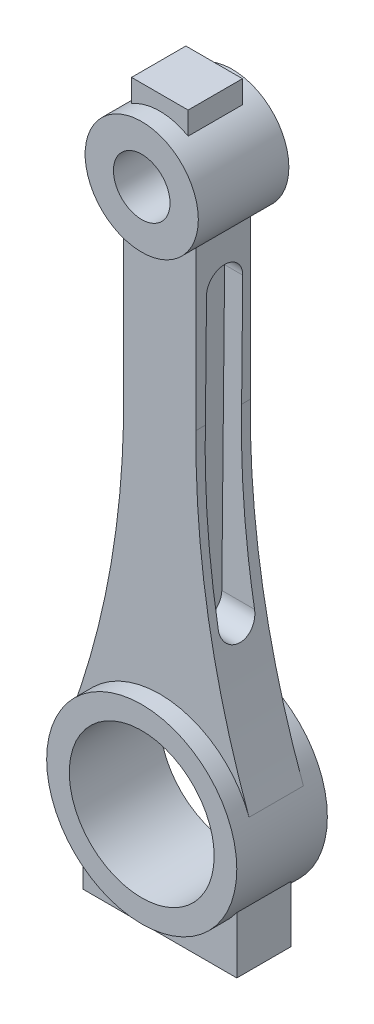
ISO-10303-21;
HEADER;
FILE_DESCRIPTION(('STEP AP214'),'2;1');
FILE_NAME('part.step','',(''),(''),'','','');
FILE_SCHEMA(('AUTOMOTIVE_DESIGN { 1 0 10303 214 1 1 1 1 }'));
ENDSEC;
DATA;
#1=APPLICATION_CONTEXT('core data for automotive mechanical design processes');
#2=APPLICATION_PROTOCOL_DEFINITION('international standard','automotive_design',2000,#1);
#3=PRODUCT_CONTEXT('',#1,'mechanical');
#4=PRODUCT('Part','Part','',(#3));
#5=PRODUCT_RELATED_PRODUCT_CATEGORY('part','',(#4));
#6=PRODUCT_DEFINITION_FORMATION('','',#4);
#7=PRODUCT_DEFINITION_CONTEXT('part definition',#1,'design');
#8=PRODUCT_DEFINITION('design','',#6,#7);
#9=PRODUCT_DEFINITION_SHAPE('','',#8);
#10=(LENGTH_UNIT() NAMED_UNIT(*) SI_UNIT(.MILLI.,.METRE.));
#11=(NAMED_UNIT(*) PLANE_ANGLE_UNIT() SI_UNIT($,.RADIAN.));
#12=(NAMED_UNIT(*) SI_UNIT($,.STERADIAN.) SOLID_ANGLE_UNIT());
#13=UNCERTAINTY_MEASURE_WITH_UNIT(LENGTH_MEASURE(1.E-05),#10,'distance_accuracy_value','');
#14=(GEOMETRIC_REPRESENTATION_CONTEXT(3) GLOBAL_UNCERTAINTY_ASSIGNED_CONTEXT((#13)) GLOBAL_UNIT_ASSIGNED_CONTEXT((#10,
#11,#12)) REPRESENTATION_CONTEXT('',''));
#15=CARTESIAN_POINT('',(0.,0.,0.));
#16=DIRECTION('',(0.,0.,1.));
#17=DIRECTION('',(1.,0.,0.));
#18=AXIS2_PLACEMENT_3D('',#15,#16,#17);
#19=CARTESIAN_POINT('',(197.984393718025,72.9601250280331,6.));
#20=DIRECTION('',(0.,0.,-1.));
#21=DIRECTION('',(-1.,0.,0.));
#22=AXIS2_PLACEMENT_3D('',#19,#20,#21);
#23=CYLINDRICAL_SURFACE('',#22,190.);
#24=CARTESIAN_POINT('',(11.2359380374151,37.9599207299516,-3.68916926509044));
#25=CARTESIAN_POINT('',(11.2573392899035,37.8457258024845,-3.68803464444008));
#26=CARTESIAN_POINT('',(11.2788373766301,37.731603732862,-3.68199054216258));
#27=CARTESIAN_POINT('',(11.3218694534566,37.5043030453218,-3.66017608058678));
#28=CARTESIAN_POINT('',(11.3434034424995,37.3911244001991,-3.64440600274162));
#29=CARTESIAN_POINT('',(11.3863453669897,37.1665300941619,-3.6032374435139));
#30=CARTESIAN_POINT('',(11.4077533330348,37.0551139932032,-3.57784140621044));
#31=CARTESIAN_POINT('',(11.450277832694,36.8348399688653,-3.51761471406636));
#32=CARTESIAN_POINT('',(11.4713943703932,36.7259820096127,-3.48278419161355));
#33=CARTESIAN_POINT('',(11.5340849236126,36.4042790668273,-3.364392398952));
#34=CARTESIAN_POINT('',(11.5750139767093,36.1962313899327,-3.26691735932956));
#35=CARTESIAN_POINT('',(11.6536808263568,35.7995751844103,-3.03760322738277));
#36=CARTESIAN_POINT('',(11.6914195686109,35.6109608914949,-2.90577436619742));
#37=CARTESIAN_POINT('',(11.7621789532305,35.2597453331294,-2.61221230413649));
#38=CARTESIAN_POINT('',(11.7952291859196,35.0969800694814,-2.45068292519178));
#39=CARTESIAN_POINT('',(11.8556681092971,34.8009793008838,-2.1015569995153));
#40=CARTESIAN_POINT('',(11.8830564389087,34.6677456792172,-1.91395879157032));
#41=CARTESIAN_POINT('',(11.9306424010361,34.4372061955792,-1.52166792073354));
#42=CARTESIAN_POINT('',(11.9509617849072,34.3392908176257,-1.31734833457949));
#43=CARTESIAN_POINT('',(11.9842669986154,34.1792070849224,-0.894610169687628));
#44=CARTESIAN_POINT('',(11.9972541680644,34.1170322002674,-0.676194174525959));
#45=CARTESIAN_POINT('',(12.0151816646436,34.0312916741689,-0.23590832566454));
#46=CARTESIAN_POINT('',(12.0202699533025,34.007016054454,-0.0141825700637141));
#47=CARTESIAN_POINT('',(12.0226582837732,33.9956155881816,0.430261163530409));
#48=CARTESIAN_POINT('',(12.0199587031381,34.0084889406554,0.652979092900833));
#49=CARTESIAN_POINT('',(12.0069443635972,34.0706752265108,1.09094000003295));
#50=CARTESIAN_POINT('',(11.9966995967896,34.119653242678,1.30623276574449));
#51=CARTESIAN_POINT('',(11.9690867282807,34.2521141428991,1.72543520117346));
#52=CARTESIAN_POINT('',(11.9517185363491,34.3355974640224,1.92934472666529));
#53=CARTESIAN_POINT('',(11.9104122047552,34.5350838516441,2.32135267206067));
#54=CARTESIAN_POINT('',(11.8864364029693,34.6512734213227,2.50935212635597));
#55=CARTESIAN_POINT('',(11.8328575586188,34.9124798052443,2.86319467439356));
#56=CARTESIAN_POINT('',(11.8032543529373,35.0574974551093,3.02903712565121));
#57=CARTESIAN_POINT('',(11.7389199818753,35.3748869564478,3.33693080705317));
#58=CARTESIAN_POINT('',(11.7041099193395,35.5476834273039,3.4785276771088));
#59=CARTESIAN_POINT('',(11.6309262369291,35.9139377996248,3.73083648432788));
#60=CARTESIAN_POINT('',(11.5925511218324,36.1074043755099,3.84153538388699));
#61=CARTESIAN_POINT('',(11.5126998641564,36.5135741817407,4.03108537928807));
#62=CARTESIAN_POINT('',(11.4711772530887,36.7265832767776,4.10925990249678));
#63=CARTESIAN_POINT('',(11.3870486928273,37.1623617440236,4.2284400309754));
#64=CARTESIAN_POINT('',(11.3444443948312,37.38511657585,4.26949915366615));
#65=CARTESIAN_POINT('',(11.2884030309025,37.681059797501,4.29854682025038));
#66=CARTESIAN_POINT('',(11.27485640803,37.7528239617369,4.30363529006597));
#67=CARTESIAN_POINT('',(11.2478376464841,37.8964125953903,4.30993120036429));
#68=CARTESIAN_POINT('',(11.2343654214005,37.9682367659793,4.31114508186216));
#69=CARTESIAN_POINT('',(11.2209326121106,38.0400792700484,4.31042913785765));
#70=B_SPLINE_CURVE_WITH_KNOTS('',3,(#24,#25,#26,#27,#28,#29,#30,#31,#32,#33,#34,#35,#36,#37,#38,
#39,#40,#41,#42,#43,#44,#45,#46,#47,#48,#49,#50,#51,#52,#53,#54,#55,#56,#57,#58,#59,#60,#61,#62,
#63,#64,#65,#66,#67,#68,#69),.UNSPECIFIED.,.F.,.F.,(4,2,2,2,2,2,2,2,2,2,2,2,2,2,2,2,2,2,2,2,2,2,
4),(0.,0.348452687276947,0.696895291400956,1.04524948341088,1.39359878745351,2.09007173351595,
2.78633749493858,3.47799226371899,4.16969112782026,4.84880634594527,5.52779744802792,
6.1939093019402,6.85998886353357,7.51996621906253,8.17995193460444,8.8437801486304,
9.50762760744787,10.1828051382855,10.8582671355624,11.5471515126776,12.235040982105,
12.4545941587138,12.6737821652143),.UNSPECIFIED.);
#71=CARTESIAN_POINT('',(11.2359380374151,37.9599207299516,-3.68916926509044));
#72=VERTEX_POINT('',#71);
#73=CARTESIAN_POINT('',(11.2209326121106,38.0400792700484,4.31042913785765));
#74=VERTEX_POINT('',#73);
#75=EDGE_CURVE('E482',#72,#74,#70,.T.);
#76=ORIENTED_EDGE('',*,*,#75,.T.);
#77=CARTESIAN_POINT('',(197.984393718025,72.9601250280331,3.96051908649262));
#78=DIRECTION('',(0.,-0.010019817512106,-0.99994980036851));
#79=DIRECTION('',(0.,0.999949800368511,-0.010019817512106));
#80=AXIS2_PLACEMENT_3D('',#77,#78,#79);
#81=ELLIPSE('',#80,190.009538408808,190.);
#82=CARTESIAN_POINT('',(8.00000000000001,75.3953136438507,3.93611771601476));
#83=VERTEX_POINT('',#82);
#84=EDGE_CURVE('E280',#74,#83,#81,.T.);
#85=ORIENTED_EDGE('',*,*,#84,.T.);
#86=DIRECTION('',(0.,0.,-1.));
#87=VECTOR('',#86,1.);
#88=CARTESIAN_POINT('',(8.00000000000001,75.3953136438507,6.));
#89=LINE('',#88,#87);
#90=CARTESIAN_POINT('',(8.00000000000001,75.3953136438507,6.));
#91=VERTEX_POINT('',#90);
#92=EDGE_CURVE('E437',#91,#83,#89,.T.);
#93=ORIENTED_EDGE('',*,*,#92,.F.);
#94=CARTESIAN_POINT('',(197.984393718025,72.9601250280331,6.));
#95=DIRECTION('',(0.,0.,1.));
#96=DIRECTION('',(1.,0.,0.));
#97=AXIS2_PLACEMENT_3D('',#94,#95,#96);
#98=CIRCLE('',#97,190.);
#99=CARTESIAN_POINT('',(19.7046079055854,7.26143424449618,6.));
#100=VERTEX_POINT('',#99);
#101=EDGE_CURVE('E403',#91,#100,#98,.T.);
#102=ORIENTED_EDGE('',*,*,#101,.T.);
#103=DIRECTION('',(0.,0.,-1.));
#104=VECTOR('',#103,1.);
#105=CARTESIAN_POINT('',(19.7046079055854,7.26143424449618,6.));
#106=LINE('',#105,#104);
#107=CARTESIAN_POINT('',(19.7046079055854,7.26143424449618,-6.));
#108=VERTEX_POINT('',#107);
#109=EDGE_CURVE('E441',#100,#108,#106,.T.);
#110=ORIENTED_EDGE('',*,*,#109,.T.);
#111=CARTESIAN_POINT('',(197.984393718025,72.9601250280331,-6.));
#112=DIRECTION('',(0.,0.,1.));
#113=DIRECTION('',(1.,0.,0.));
#114=AXIS2_PLACEMENT_3D('',#111,#112,#113);
#115=CIRCLE('',#114,190.);
#116=CARTESIAN_POINT('',(8.00000000000001,75.3953136438507,-6.));
#117=VERTEX_POINT('',#116);
#118=EDGE_CURVE('E427',#117,#108,#115,.T.);
#119=ORIENTED_EDGE('',*,*,#118,.F.);
#120=CARTESIAN_POINT('',(8.00000000000001,75.3953136438507,-4.06428390119819));
#121=VERTEX_POINT('',#120);
#122=EDGE_CURVE('E436',#121,#117,#89,.T.);
#123=ORIENTED_EDGE('',*,*,#122,.F.);
#124=CARTESIAN_POINT('',(197.984393718025,72.9601250280331,-4.03988253072034));
#125=DIRECTION('',(0.,0.010019817512106,0.999949800368511));
#126=DIRECTION('',(0.,0.999949800368511,-0.010019817512106));
#127=AXIS2_PLACEMENT_3D('',#124,#125,#126);
#128=ELLIPSE('',#127,190.009538408808,190.);
#129=EDGE_CURVE('E67',#121,#72,#128,.T.);
#130=ORIENTED_EDGE('',*,*,#129,.T.);
#131=EDGE_LOOP('',(#76,#85,#93,#102,#110,#119,#123,#130));
#132=FACE_BOUND('',#131,.T.);
#133=ADVANCED_FACE('F43',(#132),#23,.F.);
#134=CARTESIAN_POINT('',(8.00000000000002,0.,6.));
#135=DIRECTION('',(-1.,0.,0.));
#136=DIRECTION('',(0.,-1.,0.));
#137=AXIS2_PLACEMENT_3D('',#134,#135,#136);
#138=PLANE('',#137);
#139=DIRECTION('',(0.,-0.999949800368511,0.010019817512106));
#140=VECTOR('',#139,1.);
#141=CARTESIAN_POINT('',(8.00000000000002,-0.0131092418119929,4.69173428387807));
#142=LINE('',#141,#140);
#143=CARTESIAN_POINT('',(8.00000000000001,100.040079270048,3.6891692650904));
#144=VERTEX_POINT('',#143);
#145=EDGE_CURVE('E479',#144,#83,#142,.T.);
#146=ORIENTED_EDGE('',*,*,#145,.F.);
#147=CARTESIAN_POINT('',(8.,100.,-0.310629936383641));
#148=DIRECTION('',(-1.,0.,0.));
#149=DIRECTION('',(0.,-1.,0.));
#150=AXIS2_PLACEMENT_3D('',#147,#148,#149);
#151=CIRCLE('',#150,4.);
#152=CARTESIAN_POINT('',(8.00000000000001,99.9599207299516,-4.31042913785768));
#153=VERTEX_POINT('',#152);
#154=EDGE_CURVE('E476',#153,#144,#151,.F.);
#155=ORIENTED_EDGE('',*,*,#154,.F.);
#156=DIRECTION('',(0.,0.999949800368511,-0.010019817512106));
#157=VECTOR('',#156,1.);
#158=CARTESIAN_POINT('',(8.00000000000002,-0.0932677819088409,-3.30786411907001));
#159=LINE('',#158,#157);
#160=EDGE_CURVE('E467',#121,#153,#159,.T.);
#161=ORIENTED_EDGE('',*,*,#160,.F.);
#162=ORIENTED_EDGE('',*,*,#122,.T.);
#163=DIRECTION('',(0.,1.,0.));
#164=VECTOR('',#163,1.);
#165=CARTESIAN_POINT('',(8.00000000000002,0.,-6.));
#166=LINE('',#165,#164);
#167=CARTESIAN_POINT('',(8.,110.395313643851,-6.));
#168=VERTEX_POINT('',#167);
#169=EDGE_CURVE('E392',#117,#168,#166,.T.);
#170=ORIENTED_EDGE('',*,*,#169,.T.);
#171=DIRECTION('',(0.,0.,-1.));
#172=VECTOR('',#171,1.);
#173=CARTESIAN_POINT('',(8.,110.395313643851,6.));
#174=LINE('',#173,#172);
#175=CARTESIAN_POINT('',(8.,110.395313643851,6.));
#176=VERTEX_POINT('',#175);
#177=EDGE_CURVE('E411',#176,#168,#174,.T.);
#178=ORIENTED_EDGE('',*,*,#177,.F.);
#179=DIRECTION('',(0.,1.,0.));
#180=VECTOR('',#179,1.);
#181=CARTESIAN_POINT('',(8.00000000000002,0.,6.));
#182=LINE('',#181,#180);
#183=EDGE_CURVE('E407',#91,#176,#182,.T.);
#184=ORIENTED_EDGE('',*,*,#183,.F.);
#185=ORIENTED_EDGE('',*,*,#92,.T.);
#186=EDGE_LOOP('',(#146,#155,#161,#162,#170,#178,#184,#185));
#187=FACE_BOUND('',#186,.T.);
#188=ADVANCED_FACE('F577',(#187),#138,.F.);
#189=CARTESIAN_POINT('',(0.,120.,10.));
#190=DIRECTION('',(0.,0.,-1.));
#191=DIRECTION('',(-1.,0.,0.));
#192=AXIS2_PLACEMENT_3D('',#189,#190,#191);
#193=CYLINDRICAL_SURFACE('',#192,6.25);
#194=CARTESIAN_POINT('',(0.,120.,10.));
#195=DIRECTION('',(0.,0.,1.));
#196=DIRECTION('',(1.,0.,0.));
#197=AXIS2_PLACEMENT_3D('',#194,#195,#196);
#198=CIRCLE('',#197,6.25);
#199=CARTESIAN_POINT('',(6.25,120.,10.));
#200=VERTEX_POINT('',#199);
#201=EDGE_CURVE('E458',#200,#200,#198,.T.);
#202=ORIENTED_EDGE('',*,*,#201,.T.);
#203=EDGE_LOOP('',(#202));
#204=FACE_BOUND('',#203,.T.);
#205=CARTESIAN_POINT('',(0.,120.,-10.));
#206=DIRECTION('',(0.,0.,1.));
#207=DIRECTION('',(1.,0.,0.));
#208=AXIS2_PLACEMENT_3D('',#205,#206,#207);
#209=CIRCLE('',#208,6.25);
#210=CARTESIAN_POINT('',(6.25,120.,-10.));
#211=VERTEX_POINT('',#210);
#212=EDGE_CURVE('E457',#211,#211,#209,.T.);
#213=ORIENTED_EDGE('',*,*,#212,.F.);
#214=EDGE_LOOP('',(#213));
#215=FACE_BOUND('',#214,.T.);
#216=ADVANCED_FACE('F45',(#204,#215),#193,.F.);
#217=CARTESIAN_POINT('',(0.,120.,10.));
#218=DIRECTION('',(0.,0.,-1.));
#219=DIRECTION('',(-1.,0.,0.));
#220=AXIS2_PLACEMENT_3D('',#217,#218,#219);
#221=CYLINDRICAL_SURFACE('',#220,12.5);
#222=DIRECTION('',(0.,0.,-1.));
#223=VECTOR('',#222,1.);
#224=CARTESIAN_POINT('',(6.25,130.825317547305,6.));
#225=LINE('',#224,#223);
#226=CARTESIAN_POINT('',(6.25,130.825317547305,6.));
#227=VERTEX_POINT('',#226);
#228=CARTESIAN_POINT('',(6.25,130.825317547305,-6.));
#229=VERTEX_POINT('',#228);
#230=EDGE_CURVE('E318',#227,#229,#225,.T.);
#231=ORIENTED_EDGE('',*,*,#230,.F.);
#232=CARTESIAN_POINT('',(0.,120.,6.));
#233=DIRECTION('',(0.,0.,1.));
#234=DIRECTION('',(1.,0.,0.));
#235=AXIS2_PLACEMENT_3D('',#232,#233,#234);
#236=CIRCLE('',#235,12.5);
#237=CARTESIAN_POINT('',(-6.25,130.825317547305,6.));
#238=VERTEX_POINT('',#237);
#239=EDGE_CURVE('E294',#227,#238,#236,.T.);
#240=ORIENTED_EDGE('',*,*,#239,.T.);
#241=DIRECTION('',(0.,0.,-1.));
#242=VECTOR('',#241,1.);
#243=CARTESIAN_POINT('',(-6.25,130.825317547305,6.));
#244=LINE('',#243,#242);
#245=CARTESIAN_POINT('',(-6.25,130.825317547305,-6.));
#246=VERTEX_POINT('',#245);
#247=EDGE_CURVE('E322',#238,#246,#244,.T.);
#248=ORIENTED_EDGE('',*,*,#247,.T.);
#249=CARTESIAN_POINT('',(0.,120.,-6.));
#250=DIRECTION('',(0.,0.,1.));
#251=DIRECTION('',(1.,0.,0.));
#252=AXIS2_PLACEMENT_3D('',#249,#250,#251);
#253=CIRCLE('',#252,12.5);
#254=EDGE_CURVE('E309',#229,#246,#253,.T.);
#255=ORIENTED_EDGE('',*,*,#254,.F.);
#256=EDGE_LOOP('',(#231,#240,#248,#255));
#257=FACE_BOUND('',#256,.T.);
#258=DIRECTION('',(0.,0.,-1.));
#259=VECTOR('',#258,1.);
#260=CARTESIAN_POINT('',(-7.99999999999999,110.395313643851,6.));
#261=LINE('',#260,#259);
#262=CARTESIAN_POINT('',(-7.99999999999999,110.395313643851,6.));
#263=VERTEX_POINT('',#262);
#264=CARTESIAN_POINT('',(-7.99999999999999,110.395313643851,-6.));
#265=VERTEX_POINT('',#264);
#266=EDGE_CURVE('E453',#263,#265,#261,.T.);
#267=ORIENTED_EDGE('',*,*,#266,.F.);
#268=CARTESIAN_POINT('',(0.,120.,6.));
#269=DIRECTION('',(0.,0.,1.));
#270=DIRECTION('',(1.,0.,0.));
#271=AXIS2_PLACEMENT_3D('',#268,#269,#270);
#272=CIRCLE('',#271,12.5);
#273=EDGE_CURVE('E388',#263,#176,#272,.T.);
#274=ORIENTED_EDGE('',*,*,#273,.T.);
#275=ORIENTED_EDGE('',*,*,#177,.T.);
#276=CARTESIAN_POINT('',(0.,120.,-6.));
#277=DIRECTION('',(0.,0.,1.));
#278=DIRECTION('',(1.,0.,0.));
#279=AXIS2_PLACEMENT_3D('',#276,#277,#278);
#280=CIRCLE('',#279,12.5);
#281=EDGE_CURVE('E381',#265,#168,#280,.T.);
#282=ORIENTED_EDGE('',*,*,#281,.F.);
#283=EDGE_LOOP('',(#267,#274,#275,#282));
#284=FACE_BOUND('',#283,.T.);
#285=CARTESIAN_POINT('',(0.,120.,10.));
#286=DIRECTION('',(0.,0.,1.));
#287=DIRECTION('',(1.,0.,0.));
#288=AXIS2_PLACEMENT_3D('',#285,#286,#287);
#289=CIRCLE('',#288,12.5);
#290=CARTESIAN_POINT('',(12.5,120.,10.));
#291=VERTEX_POINT('',#290);
#292=EDGE_CURVE('E462',#291,#291,#289,.T.);
#293=ORIENTED_EDGE('',*,*,#292,.F.);
#294=EDGE_LOOP('',(#293));
#295=FACE_BOUND('',#294,.T.);
#296=CARTESIAN_POINT('',(0.,120.,-10.));
#297=DIRECTION('',(0.,0.,1.));
#298=DIRECTION('',(1.,0.,0.));
#299=AXIS2_PLACEMENT_3D('',#296,#297,#298);
#300=CIRCLE('',#299,12.5);
#301=CARTESIAN_POINT('',(12.5,120.,-10.));
#302=VERTEX_POINT('',#301);
#303=EDGE_CURVE('E463',#302,#302,#300,.T.);
#304=ORIENTED_EDGE('',*,*,#303,.T.);
#305=EDGE_LOOP('',(#304));
#306=FACE_BOUND('',#305,.T.);
#307=ADVANCED_FACE('F584',(#257,#284,#295,#306),#221,.T.);
#308=CARTESIAN_POINT('',(0.,0.,10.));
#309=DIRECTION('',(0.,0.,1.));
#310=DIRECTION('',(1.,0.,0.));
#311=AXIS2_PLACEMENT_3D('',#308,#309,#310);
#312=PLANE('',#311);
#313=ORIENTED_EDGE('',*,*,#201,.F.);
#314=EDGE_LOOP('',(#313));
#315=FACE_BOUND('',#314,.T.);
#316=ORIENTED_EDGE('',*,*,#292,.T.);
#317=EDGE_LOOP('',(#316));
#318=FACE_BOUND('',#317,.T.);
#319=ADVANCED_FACE('F632',(#315,#318),#312,.T.);
#320=CARTESIAN_POINT('',(0.,0.,-10.));
#321=DIRECTION('',(0.,0.,1.));
#322=DIRECTION('',(1.,0.,0.));
#323=AXIS2_PLACEMENT_3D('',#320,#321,#322);
#324=PLANE('',#323);
#325=ORIENTED_EDGE('',*,*,#212,.T.);
#326=EDGE_LOOP('',(#325));
#327=FACE_BOUND('',#326,.T.);
#328=ORIENTED_EDGE('',*,*,#303,.F.);
#329=EDGE_LOOP('',(#328));
#330=FACE_BOUND('',#329,.T.);
#331=ADVANCED_FACE('F630',(#327,#330),#324,.F.);
#332=CARTESIAN_POINT('',(-7.99999999999999,0.,6.));
#333=DIRECTION('',(-1.,0.,0.));
#334=DIRECTION('',(0.,0.,1.));
#335=AXIS2_PLACEMENT_3D('',#332,#333,#334);
#336=PLANE('',#335);
#337=DIRECTION('',(0.,-0.999949800368511,0.010019817512106));
#338=VECTOR('',#337,1.);
#339=CARTESIAN_POINT('',(-7.99999999999999,-0.0932677819088425,-3.30786411907001));
#340=LINE('',#339,#338);
#341=CARTESIAN_POINT('',(-8.,99.9599207299516,-4.31042913785768));
#342=VERTEX_POINT('',#341);
#343=CARTESIAN_POINT('',(-8.00000000000001,75.3953136438507,-4.06428390119819));
#344=VERTEX_POINT('',#343);
#345=EDGE_CURVE('E247',#342,#344,#340,.T.);
#346=ORIENTED_EDGE('',*,*,#345,.F.);
#347=CARTESIAN_POINT('',(-7.99999999999999,100.,-0.310629936383641));
#348=DIRECTION('',(-1.,0.,0.));
#349=DIRECTION('',(0.,0.,1.));
#350=AXIS2_PLACEMENT_3D('',#347,#348,#349);
#351=CIRCLE('',#350,4.);
#352=CARTESIAN_POINT('',(-8.,100.040079270048,3.6891692650904));
#353=VERTEX_POINT('',#352);
#354=EDGE_CURVE('E11',#353,#342,#351,.T.);
#355=ORIENTED_EDGE('',*,*,#354,.F.);
#356=DIRECTION('',(0.,0.999949800368511,-0.010019817512106));
#357=VECTOR('',#356,1.);
#358=CARTESIAN_POINT('',(-7.99999999999999,-0.0131092418119945,4.69173428387807));
#359=LINE('',#358,#357);
#360=CARTESIAN_POINT('',(-8.00000000000001,75.3953136438507,3.93611771601476));
#361=VERTEX_POINT('',#360);
#362=EDGE_CURVE('E215',#361,#353,#359,.T.);
#363=ORIENTED_EDGE('',*,*,#362,.F.);
#364=DIRECTION('',(0.,0.,-1.));
#365=VECTOR('',#364,1.);
#366=CARTESIAN_POINT('',(-7.99999999999999,75.3953136438507,6.));
#367=LINE('',#366,#365);
#368=CARTESIAN_POINT('',(-7.99999999999999,75.3953136438507,6.));
#369=VERTEX_POINT('',#368);
#370=EDGE_CURVE('E449',#369,#361,#367,.T.);
#371=ORIENTED_EDGE('',*,*,#370,.F.);
#372=DIRECTION('',(0.,1.,0.));
#373=VECTOR('',#372,1.);
#374=CARTESIAN_POINT('',(-7.99999999999999,0.,6.));
#375=LINE('',#374,#373);
#376=EDGE_CURVE('E391',#369,#263,#375,.T.);
#377=ORIENTED_EDGE('',*,*,#376,.T.);
#378=ORIENTED_EDGE('',*,*,#266,.T.);
#379=DIRECTION('',(0.,1.,0.));
#380=VECTOR('',#379,1.);
#381=CARTESIAN_POINT('',(-7.99999999999999,0.,-6.));
#382=LINE('',#381,#380);
#383=CARTESIAN_POINT('',(-7.99999999999999,75.3953136438507,-6.));
#384=VERTEX_POINT('',#383);
#385=EDGE_CURVE('E415',#384,#265,#382,.T.);
#386=ORIENTED_EDGE('',*,*,#385,.F.);
#387=EDGE_CURVE('E448',#344,#384,#367,.T.);
#388=ORIENTED_EDGE('',*,*,#387,.F.);
#389=EDGE_LOOP('',(#346,#355,#363,#371,#377,#378,#386,#388));
#390=FACE_BOUND('',#389,.T.);
#391=ADVANCED_FACE('F626',(#390),#336,.T.);
#392=CARTESIAN_POINT('',(-197.984393718025,72.960125028033,6.));
#393=DIRECTION('',(0.,0.,-1.));
#394=DIRECTION('',(-1.,0.,0.));
#395=AXIS2_PLACEMENT_3D('',#392,#393,#394);
#396=CYLINDRICAL_SURFACE('',#395,190.);
#397=CARTESIAN_POINT('',(-11.2209326121106,38.0400792700484,4.31042913785765));
#398=CARTESIAN_POINT('',(-11.2422918197905,37.9258378445489,4.31158354900229));
#399=CARTESIAN_POINT('',(-11.2637657264759,37.8115743068779,4.30782392249587));
#400=CARTESIAN_POINT('',(-11.3067860096547,37.5838037096387,4.29055524600473));
#401=CARTESIAN_POINT('',(-11.3283323837532,37.4702966254336,4.27704651512004));
#402=CARTESIAN_POINT('',(-11.3713360230604,37.2448638704104,4.24036352406868));
#403=CARTESIAN_POINT('',(-11.3927933117012,37.1329377623256,4.21719199278791));
#404=CARTESIAN_POINT('',(-11.4354546292819,36.9114624877695,4.16136313139912));
#405=CARTESIAN_POINT('',(-11.456658661519,36.8019132903368,4.12870592493038));
#406=CARTESIAN_POINT('',(-11.5196690865464,36.4778735422106,4.0167407927167));
#407=CARTESIAN_POINT('',(-11.5608887463665,36.2679126279731,3.92342657480642));
#408=CARTESIAN_POINT('',(-11.6402923007287,35.8667587072866,3.70206303987675));
#409=CARTESIAN_POINT('',(-11.6784770610995,35.6755603443758,3.57402367594822));
#410=CARTESIAN_POINT('',(-11.7502934240686,35.3184875444892,3.2874642234685));
#411=CARTESIAN_POINT('',(-11.7839513578261,35.1524658712039,3.12913465727676));
#412=CARTESIAN_POINT('',(-11.8457335178769,34.8494550108252,2.78580511654033));
#413=CARTESIAN_POINT('',(-11.8738573860849,34.7124677023755,2.60080341749879));
#414=CARTESIAN_POINT('',(-11.9230138009257,34.4740560120361,2.21289698958114));
#415=CARTESIAN_POINT('',(-11.9441637715485,34.3720414627228,2.01036998990736));
#416=CARTESIAN_POINT('',(-11.9791948759147,34.2035325153383,1.59047009674739));
#417=CARTESIAN_POINT('',(-11.993077340224,34.1370316152324,1.3730999290554));
#418=CARTESIAN_POINT('',(-12.0128034187397,34.0426495179178,0.934170478014535));
#419=CARTESIAN_POINT('',(-12.0187964952649,34.0140502127713,0.712772148133114));
#420=CARTESIAN_POINT('',(-12.0229877426866,33.9940423054742,0.268230415957506));
#421=CARTESIAN_POINT('',(-12.0211863264954,34.0026317332551,0.0450871067284754));
#422=CARTESIAN_POINT('',(-12.0099210964895,34.0564457972838,-0.394267901498412));
#423=CARTESIAN_POINT('',(-12.0005337073741,34.1013050365447,-0.610526480051656));
#424=CARTESIAN_POINT('',(-11.9745716439461,34.2257720652061,-1.03233692067507));
#425=CARTESIAN_POINT('',(-11.9579969122864,34.3053801318643,-1.23788869730198));
#426=CARTESIAN_POINT('',(-11.9182072247445,34.4973657269376,-1.63363456728297));
#427=CARTESIAN_POINT('',(-11.8949596525242,34.6099042708896,-1.82374719158603));
#428=CARTESIAN_POINT('',(-11.8427327351194,34.8642086745661,-2.18238941226392));
#429=CARTESIAN_POINT('',(-11.8137532402174,35.0059752977303,-2.35091844468726));
#430=CARTESIAN_POINT('',(-11.7505689303897,35.3172228621859,-2.66465893362602));
#431=CARTESIAN_POINT('',(-11.7162852279883,35.4871255124034,-2.80943597784595));
#432=CARTESIAN_POINT('',(-11.644022023652,35.8481361437127,-3.06855150499719));
#433=CARTESIAN_POINT('',(-11.6060409711496,36.0392530262272,-3.18287714169617));
#434=CARTESIAN_POINT('',(-11.5268393179619,36.4413186665105,-3.38012671679121));
#435=CARTESIAN_POINT('',(-11.485569057416,36.6525880495257,-3.46237560754309));
#436=CARTESIAN_POINT('',(-11.4017989792526,37.0855693552885,-3.58996005288053));
#437=CARTESIAN_POINT('',(-11.3593010170352,37.3072658087564,-3.63534857198765));
#438=CARTESIAN_POINT('',(-11.3033281867263,37.6021683049548,-3.67018738013791));
#439=CARTESIAN_POINT('',(-11.28980773696,37.6736276547905,-3.67668008588045));
#440=CARTESIAN_POINT('',(-11.2628268326493,37.8166800576629,-3.68580689576495));
#441=CARTESIAN_POINT('',(-11.2493663157002,37.8882726901241,-3.68844740501623));
#442=CARTESIAN_POINT('',(-11.2359380374151,37.9599207299516,-3.68916926509044));
#443=B_SPLINE_CURVE_WITH_KNOTS('',3,(#397,#398,#399,#400,#401,#402,#403,#404,#405,#406,#407,
#408,#409,#410,#411,#412,#413,#414,#415,#416,#417,#418,#419,#420,#421,#422,#423,#424,#425,#426,
#427,#428,#429,#430,#431,#432,#433,#434,#435,#436,#437,#438,#439,#440,#441,#442),.UNSPECIFIED.,
.F.,.F.,(4,2,2,2,2,2,2,2,2,2,2,2,2,2,2,2,2,2,2,2,2,2,4),(0.,0.348566777331012,0.69712214616556,
1.04557914554924,1.39403160323813,2.09069764057275,2.78716420673607,3.47938611771956,
4.17165280466058,4.85158472702981,5.53139212099761,6.19812601550307,6.86482459029931,
7.5248890381044,8.18495875260038,8.84831144313765,9.5116814626925,10.186084085793,
10.8607707634278,11.5489752418064,12.236189083482,12.4551663946325,12.6737791920591),.UNSPECIFIED.);
#444=CARTESIAN_POINT('',(-11.2209326121105,38.0400792700484,4.31042913785765));
#445=VERTEX_POINT('',#444);
#446=CARTESIAN_POINT('',(-11.2359380374151,37.9599207299516,-3.68916926509044));
#447=VERTEX_POINT('',#446);
#448=EDGE_CURVE('E616',#445,#447,#443,.T.);
#449=ORIENTED_EDGE('',*,*,#448,.T.);
#450=CARTESIAN_POINT('',(-197.984393718025,72.960125028033,-4.03988253072034));
#451=DIRECTION('',(0.,-0.010019817512106,-0.999949800368511));
#452=DIRECTION('',(0.,0.999949800368511,-0.010019817512106));
#453=AXIS2_PLACEMENT_3D('',#450,#451,#452);
#454=ELLIPSE('',#453,190.009538408808,190.);
#455=EDGE_CURVE('E52',#447,#344,#454,.F.);
#456=ORIENTED_EDGE('',*,*,#455,.T.);
#457=ORIENTED_EDGE('',*,*,#387,.T.);
#458=CARTESIAN_POINT('',(-197.984393718025,72.960125028033,-6.));
#459=DIRECTION('',(0.,0.,1.));
#460=DIRECTION('',(1.,0.,0.));
#461=AXIS2_PLACEMENT_3D('',#458,#459,#460);
#462=CIRCLE('',#461,190.);
#463=CARTESIAN_POINT('',(-19.7046079055854,7.26143424449618,-6.));
#464=VERTEX_POINT('',#463);
#465=EDGE_CURVE('E419',#384,#464,#462,.F.);
#466=ORIENTED_EDGE('',*,*,#465,.T.);
#467=DIRECTION('',(0.,0.,-1.));
#468=VECTOR('',#467,1.);
#469=CARTESIAN_POINT('',(-19.7046079055854,7.26143424449618,6.));
#470=LINE('',#469,#468);
#471=CARTESIAN_POINT('',(-19.7046079055854,7.26143424449618,6.));
#472=VERTEX_POINT('',#471);
#473=EDGE_CURVE('E445',#472,#464,#470,.T.);
#474=ORIENTED_EDGE('',*,*,#473,.F.);
#475=CARTESIAN_POINT('',(-197.984393718025,72.960125028033,6.));
#476=DIRECTION('',(0.,0.,1.));
#477=DIRECTION('',(1.,0.,0.));
#478=AXIS2_PLACEMENT_3D('',#475,#476,#477);
#479=CIRCLE('',#478,190.);
#480=EDGE_CURVE('E396',#369,#472,#479,.F.);
#481=ORIENTED_EDGE('',*,*,#480,.F.);
#482=ORIENTED_EDGE('',*,*,#370,.T.);
#483=CARTESIAN_POINT('',(-197.984393718025,72.960125028033,3.96051908649262));
#484=DIRECTION('',(0.,0.010019817512106,0.99994980036851));
#485=DIRECTION('',(0.,0.999949800368511,-0.010019817512106));
#486=AXIS2_PLACEMENT_3D('',#483,#484,#485);
#487=ELLIPSE('',#486,190.009538408808,190.);
#488=EDGE_CURVE('E492',#361,#445,#487,.F.);
#489=ORIENTED_EDGE('',*,*,#488,.T.);
#490=EDGE_LOOP('',(#449,#456,#457,#466,#474,#481,#482,#489));
#491=FACE_BOUND('',#490,.T.);
#492=ADVANCED_FACE('F573',(#491),#396,.F.);
#493=CARTESIAN_POINT('',(0.,0.,6.));
#494=DIRECTION('',(0.,0.,1.));
#495=DIRECTION('',(1.,0.,0.));
#496=AXIS2_PLACEMENT_3D('',#493,#494,#495);
#497=PLANE('',#496);
#498=ORIENTED_EDGE('',*,*,#273,.F.);
#499=ORIENTED_EDGE('',*,*,#376,.F.);
#500=ORIENTED_EDGE('',*,*,#480,.T.);
#501=CARTESIAN_POINT('',(0.,0.,6.));
#502=DIRECTION('',(0.,0.,1.));
#503=DIRECTION('',(1.,0.,0.));
#504=AXIS2_PLACEMENT_3D('',#501,#502,#503);
#505=CIRCLE('',#504,21.);
#506=EDGE_CURVE('E400',#100,#472,#505,.T.);
#507=ORIENTED_EDGE('',*,*,#506,.F.);
#508=ORIENTED_EDGE('',*,*,#101,.F.);
#509=ORIENTED_EDGE('',*,*,#183,.T.);
#510=EDGE_LOOP('',(#498,#499,#500,#507,#508,#509));
#511=FACE_BOUND('',#510,.T.);
#512=ADVANCED_FACE('F570',(#511),#497,.T.);
#513=CARTESIAN_POINT('',(0.,0.,-6.));
#514=DIRECTION('',(0.,0.,1.));
#515=DIRECTION('',(1.,0.,0.));
#516=AXIS2_PLACEMENT_3D('',#513,#514,#515);
#517=PLANE('',#516);
#518=ORIENTED_EDGE('',*,*,#281,.T.);
#519=ORIENTED_EDGE('',*,*,#169,.F.);
#520=ORIENTED_EDGE('',*,*,#118,.T.);
#521=CARTESIAN_POINT('',(0.,0.,-6.));
#522=DIRECTION('',(0.,0.,1.));
#523=DIRECTION('',(1.,0.,0.));
#524=AXIS2_PLACEMENT_3D('',#521,#522,#523);
#525=CIRCLE('',#524,21.);
#526=EDGE_CURVE('E423',#108,#464,#525,.T.);
#527=ORIENTED_EDGE('',*,*,#526,.T.);
#528=ORIENTED_EDGE('',*,*,#465,.F.);
#529=ORIENTED_EDGE('',*,*,#385,.T.);
#530=EDGE_LOOP('',(#518,#519,#520,#527,#528,#529));
#531=FACE_BOUND('',#530,.T.);
#532=ADVANCED_FACE('F568',(#531),#517,.F.);
#533=CARTESIAN_POINT('',(0.,0.,10.));
#534=DIRECTION('',(0.,0.,-1.));
#535=DIRECTION('',(-1.,0.,0.));
#536=AXIS2_PLACEMENT_3D('',#533,#534,#535);
#537=CYLINDRICAL_SURFACE('',#536,16.);
#538=CARTESIAN_POINT('',(0.,0.,10.));
#539=DIRECTION('',(0.,0.,1.));
#540=DIRECTION('',(1.,0.,0.));
#541=AXIS2_PLACEMENT_3D('',#538,#539,#540);
#542=CIRCLE('',#541,16.);
#543=CARTESIAN_POINT('',(16.,0.,10.));
#544=VERTEX_POINT('',#543);
#545=EDGE_CURVE('E372',#544,#544,#542,.T.);
#546=ORIENTED_EDGE('',*,*,#545,.T.);
#547=EDGE_LOOP('',(#546));
#548=FACE_BOUND('',#547,.T.);
#549=CARTESIAN_POINT('',(0.,0.,-10.));
#550=DIRECTION('',(0.,0.,1.));
#551=DIRECTION('',(1.,0.,0.));
#552=AXIS2_PLACEMENT_3D('',#549,#550,#551);
#553=CIRCLE('',#552,16.);
#554=CARTESIAN_POINT('',(16.,0.,-10.));
#555=VERTEX_POINT('',#554);
#556=EDGE_CURVE('E371',#555,#555,#553,.T.);
#557=ORIENTED_EDGE('',*,*,#556,.F.);
#558=EDGE_LOOP('',(#557));
#559=FACE_BOUND('',#558,.T.);
#560=ADVANCED_FACE('F564',(#548,#559),#537,.F.);
#561=CARTESIAN_POINT('',(0.,0.,10.));
#562=DIRECTION('',(0.,0.,-1.));
#563=DIRECTION('',(-1.,0.,0.));
#564=AXIS2_PLACEMENT_3D('',#561,#562,#563);
#565=CYLINDRICAL_SURFACE('',#564,21.);
#566=DIRECTION('',(0.,0.,-1.));
#567=VECTOR('',#566,1.);
#568=CARTESIAN_POINT('',(-17.,-12.328828005938,6.));
#569=LINE('',#568,#567);
#570=CARTESIAN_POINT('',(-17.,-12.328828005938,6.));
#571=VERTEX_POINT('',#570);
#572=CARTESIAN_POINT('',(-17.,-12.328828005938,-6.));
#573=VERTEX_POINT('',#572);
#574=EDGE_CURVE('E367',#571,#573,#569,.T.);
#575=ORIENTED_EDGE('',*,*,#574,.F.);
#576=CARTESIAN_POINT('',(0.,0.,6.));
#577=DIRECTION('',(0.,0.,1.));
#578=DIRECTION('',(1.,0.,0.));
#579=AXIS2_PLACEMENT_3D('',#576,#577,#578);
#580=CIRCLE('',#579,21.);
#581=CARTESIAN_POINT('',(17.,-12.328828005938,6.));
#582=VERTEX_POINT('',#581);
#583=EDGE_CURVE('E329',#571,#582,#580,.T.);
#584=ORIENTED_EDGE('',*,*,#583,.T.);
#585=DIRECTION('',(0.,0.,-1.));
#586=VECTOR('',#585,1.);
#587=CARTESIAN_POINT('',(17.,-12.328828005938,6.));
#588=LINE('',#587,#586);
#589=CARTESIAN_POINT('',(17.,-12.328828005938,-6.));
#590=VERTEX_POINT('',#589);
#591=EDGE_CURVE('E344',#582,#590,#588,.T.);
#592=ORIENTED_EDGE('',*,*,#591,.T.);
#593=CARTESIAN_POINT('',(0.,0.,-6.));
#594=DIRECTION('',(0.,0.,1.));
#595=DIRECTION('',(1.,0.,0.));
#596=AXIS2_PLACEMENT_3D('',#593,#594,#595);
#597=CIRCLE('',#596,21.);
#598=EDGE_CURVE('E328',#573,#590,#597,.T.);
#599=ORIENTED_EDGE('',*,*,#598,.F.);
#600=EDGE_LOOP('',(#575,#584,#592,#599));
#601=FACE_BOUND('',#600,.T.);
#602=ORIENTED_EDGE('',*,*,#506,.T.);
#603=ORIENTED_EDGE('',*,*,#473,.T.);
#604=ORIENTED_EDGE('',*,*,#526,.F.);
#605=ORIENTED_EDGE('',*,*,#109,.F.);
#606=EDGE_LOOP('',(#602,#603,#604,#605));
#607=FACE_BOUND('',#606,.T.);
#608=CARTESIAN_POINT('',(0.,0.,10.));
#609=DIRECTION('',(0.,0.,1.));
#610=DIRECTION('',(1.,0.,0.));
#611=AXIS2_PLACEMENT_3D('',#608,#609,#610);
#612=CIRCLE('',#611,21.);
#613=CARTESIAN_POINT('',(21.,0.,10.));
#614=VERTEX_POINT('',#613);
#615=EDGE_CURVE('E376',#614,#614,#612,.T.);
#616=ORIENTED_EDGE('',*,*,#615,.F.);
#617=EDGE_LOOP('',(#616));
#618=FACE_BOUND('',#617,.T.);
#619=CARTESIAN_POINT('',(0.,0.,-10.));
#620=DIRECTION('',(0.,0.,1.));
#621=DIRECTION('',(1.,0.,0.));
#622=AXIS2_PLACEMENT_3D('',#619,#620,#621);
#623=CIRCLE('',#622,21.);
#624=CARTESIAN_POINT('',(21.,0.,-10.));
#625=VERTEX_POINT('',#624);
#626=EDGE_CURVE('E377',#625,#625,#623,.T.);
#627=ORIENTED_EDGE('',*,*,#626,.T.);
#628=EDGE_LOOP('',(#627));
#629=FACE_BOUND('',#628,.T.);
#630=ADVANCED_FACE('F557',(#601,#607,#618,#629),#565,.T.);
#631=CARTESIAN_POINT('',(0.,0.,10.));
#632=DIRECTION('',(0.,0.,1.));
#633=DIRECTION('',(1.,0.,0.));
#634=AXIS2_PLACEMENT_3D('',#631,#632,#633);
#635=PLANE('',#634);
#636=ORIENTED_EDGE('',*,*,#545,.F.);
#637=EDGE_LOOP('',(#636));
#638=FACE_BOUND('',#637,.T.);
#639=ORIENTED_EDGE('',*,*,#615,.T.);
#640=EDGE_LOOP('',(#639));
#641=FACE_BOUND('',#640,.T.);
#642=ADVANCED_FACE('F554',(#638,#641),#635,.T.);
#643=CARTESIAN_POINT('',(0.,0.,-10.));
#644=DIRECTION('',(0.,0.,1.));
#645=DIRECTION('',(1.,0.,0.));
#646=AXIS2_PLACEMENT_3D('',#643,#644,#645);
#647=PLANE('',#646);
#648=ORIENTED_EDGE('',*,*,#556,.T.);
#649=EDGE_LOOP('',(#648));
#650=FACE_BOUND('',#649,.T.);
#651=ORIENTED_EDGE('',*,*,#626,.F.);
#652=EDGE_LOOP('',(#651));
#653=FACE_BOUND('',#652,.T.);
#654=ADVANCED_FACE('F552',(#650,#653),#647,.F.);
#655=CARTESIAN_POINT('',(-17.,0.,6.));
#656=DIRECTION('',(-1.,0.,0.));
#657=DIRECTION('',(0.,0.,1.));
#658=AXIS2_PLACEMENT_3D('',#655,#656,#657);
#659=PLANE('',#658);
#660=DIRECTION('',(0.,1.,0.));
#661=VECTOR('',#660,1.);
#662=CARTESIAN_POINT('',(-17.,0.,-6.));
#663=LINE('',#662,#661);
#664=CARTESIAN_POINT('',(-17.,-24.828828005938,-6.));
#665=VERTEX_POINT('',#664);
#666=EDGE_CURVE('E348',#665,#573,#663,.T.);
#667=ORIENTED_EDGE('',*,*,#666,.F.);
#668=DIRECTION('',(0.,0.,-1.));
#669=VECTOR('',#668,1.);
#670=CARTESIAN_POINT('',(-17.,-24.828828005938,6.));
#671=LINE('',#670,#669);
#672=CARTESIAN_POINT('',(-17.,-24.828828005938,6.));
#673=VERTEX_POINT('',#672);
#674=EDGE_CURVE('E364',#673,#665,#671,.T.);
#675=ORIENTED_EDGE('',*,*,#674,.F.);
#676=DIRECTION('',(0.,1.,0.));
#677=VECTOR('',#676,1.);
#678=CARTESIAN_POINT('',(-17.,0.,6.));
#679=LINE('',#678,#677);
#680=EDGE_CURVE('E332',#673,#571,#679,.T.);
#681=ORIENTED_EDGE('',*,*,#680,.T.);
#682=ORIENTED_EDGE('',*,*,#574,.T.);
#683=EDGE_LOOP('',(#667,#675,#681,#682));
#684=FACE_BOUND('',#683,.T.);
#685=ADVANCED_FACE('F548',(#684),#659,.T.);
#686=CARTESIAN_POINT('',(0.,-24.828828005938,6.));
#687=DIRECTION('',(0.,1.,0.));
#688=DIRECTION('',(0.,0.,1.));
#689=AXIS2_PLACEMENT_3D('',#686,#687,#688);
#690=PLANE('',#689);
#691=DIRECTION('',(1.,0.,0.));
#692=VECTOR('',#691,1.);
#693=CARTESIAN_POINT('',(0.,-24.828828005938,-6.));
#694=LINE('',#693,#692);
#695=CARTESIAN_POINT('',(17.,-24.828828005938,-6.));
#696=VERTEX_POINT('',#695);
#697=EDGE_CURVE('E352',#665,#696,#694,.T.);
#698=ORIENTED_EDGE('',*,*,#697,.T.);
#699=DIRECTION('',(0.,0.,-1.));
#700=VECTOR('',#699,1.);
#701=CARTESIAN_POINT('',(17.,-24.828828005938,6.));
#702=LINE('',#701,#700);
#703=CARTESIAN_POINT('',(17.,-24.828828005938,6.));
#704=VERTEX_POINT('',#703);
#705=EDGE_CURVE('E360',#704,#696,#702,.T.);
#706=ORIENTED_EDGE('',*,*,#705,.F.);
#707=DIRECTION('',(1.,0.,0.));
#708=VECTOR('',#707,1.);
#709=CARTESIAN_POINT('',(0.,-24.828828005938,6.));
#710=LINE('',#709,#708);
#711=EDGE_CURVE('E337',#673,#704,#710,.T.);
#712=ORIENTED_EDGE('',*,*,#711,.F.);
#713=ORIENTED_EDGE('',*,*,#674,.T.);
#714=EDGE_LOOP('',(#698,#706,#712,#713));
#715=FACE_BOUND('',#714,.T.);
#716=ADVANCED_FACE('F544',(#715),#690,.F.);
#717=CARTESIAN_POINT('',(17.,0.,6.));
#718=DIRECTION('',(-1.,0.,0.));
#719=DIRECTION('',(0.,-1.,0.));
#720=AXIS2_PLACEMENT_3D('',#717,#718,#719);
#721=PLANE('',#720);
#722=DIRECTION('',(0.,1.,0.));
#723=VECTOR('',#722,1.);
#724=CARTESIAN_POINT('',(17.,0.,-6.));
#725=LINE('',#724,#723);
#726=EDGE_CURVE('E333',#696,#590,#725,.T.);
#727=ORIENTED_EDGE('',*,*,#726,.T.);
#728=ORIENTED_EDGE('',*,*,#591,.F.);
#729=DIRECTION('',(0.,1.,0.));
#730=VECTOR('',#729,1.);
#731=CARTESIAN_POINT('',(17.,0.,6.));
#732=LINE('',#731,#730);
#733=EDGE_CURVE('E340',#704,#582,#732,.T.);
#734=ORIENTED_EDGE('',*,*,#733,.F.);
#735=ORIENTED_EDGE('',*,*,#705,.T.);
#736=EDGE_LOOP('',(#727,#728,#734,#735));
#737=FACE_BOUND('',#736,.T.);
#738=ADVANCED_FACE('F537',(#737),#721,.F.);
#739=CARTESIAN_POINT('',(0.,0.,6.));
#740=DIRECTION('',(0.,0.,1.));
#741=DIRECTION('',(1.,0.,0.));
#742=AXIS2_PLACEMENT_3D('',#739,#740,#741);
#743=PLANE('',#742);
#744=ORIENTED_EDGE('',*,*,#583,.F.);
#745=ORIENTED_EDGE('',*,*,#680,.F.);
#746=ORIENTED_EDGE('',*,*,#711,.T.);
#747=ORIENTED_EDGE('',*,*,#733,.T.);
#748=EDGE_LOOP('',(#744,#745,#746,#747));
#749=FACE_BOUND('',#748,.T.);
#750=ADVANCED_FACE('F534',(#749),#743,.T.);
#751=CARTESIAN_POINT('',(0.,0.,-6.));
#752=DIRECTION('',(0.,0.,1.));
#753=DIRECTION('',(1.,0.,0.));
#754=AXIS2_PLACEMENT_3D('',#751,#752,#753);
#755=PLANE('',#754);
#756=ORIENTED_EDGE('',*,*,#598,.T.);
#757=ORIENTED_EDGE('',*,*,#726,.F.);
#758=ORIENTED_EDGE('',*,*,#697,.F.);
#759=ORIENTED_EDGE('',*,*,#666,.T.);
#760=EDGE_LOOP('',(#756,#757,#758,#759));
#761=FACE_BOUND('',#760,.T.);
#762=ADVANCED_FACE('F532',(#761),#755,.F.);
#763=CARTESIAN_POINT('',(0.,135.825317547305,6.));
#764=DIRECTION('',(0.,1.,0.));
#765=DIRECTION('',(0.,0.,1.));
#766=AXIS2_PLACEMENT_3D('',#763,#764,#765);
#767=PLANE('',#766);
#768=DIRECTION('',(1.,0.,0.));
#769=VECTOR('',#768,1.);
#770=CARTESIAN_POINT('',(0.,135.825317547305,-6.));
#771=LINE('',#770,#769);
#772=CARTESIAN_POINT('',(-6.25,135.825317547305,-6.));
#773=VERTEX_POINT('',#772);
#774=CARTESIAN_POINT('',(6.25,135.825317547305,-6.));
#775=VERTEX_POINT('',#774);
#776=EDGE_CURVE('E284',#773,#775,#771,.T.);
#777=ORIENTED_EDGE('',*,*,#776,.F.);
#778=DIRECTION('',(0.,0.,-1.));
#779=VECTOR('',#778,1.);
#780=CARTESIAN_POINT('',(-6.25,135.825317547305,6.));
#781=LINE('',#780,#779);
#782=CARTESIAN_POINT('',(-6.25,135.825317547305,6.));
#783=VERTEX_POINT('',#782);
#784=EDGE_CURVE('E325',#783,#773,#781,.T.);
#785=ORIENTED_EDGE('',*,*,#784,.F.);
#786=DIRECTION('',(1.,0.,0.));
#787=VECTOR('',#786,1.);
#788=CARTESIAN_POINT('',(0.,135.825317547305,6.));
#789=LINE('',#788,#787);
#790=CARTESIAN_POINT('',(6.25,135.825317547305,6.));
#791=VERTEX_POINT('',#790);
#792=EDGE_CURVE('E285',#783,#791,#789,.T.);
#793=ORIENTED_EDGE('',*,*,#792,.T.);
#794=DIRECTION('',(0.,0.,-1.));
#795=VECTOR('',#794,1.);
#796=CARTESIAN_POINT('',(6.25,135.825317547305,6.));
#797=LINE('',#796,#795);
#798=EDGE_CURVE('E301',#791,#775,#797,.T.);
#799=ORIENTED_EDGE('',*,*,#798,.T.);
#800=EDGE_LOOP('',(#777,#785,#793,#799));
#801=FACE_BOUND('',#800,.T.);
#802=ADVANCED_FACE('F528',(#801),#767,.T.);
#803=CARTESIAN_POINT('',(-6.25,0.,6.));
#804=DIRECTION('',(1.,0.,0.));
#805=DIRECTION('',(0.,0.,-1.));
#806=AXIS2_PLACEMENT_3D('',#803,#804,#805);
#807=PLANE('',#806);
#808=DIRECTION('',(0.,-1.,0.));
#809=VECTOR('',#808,1.);
#810=CARTESIAN_POINT('',(-6.25,0.,-6.));
#811=LINE('',#810,#809);
#812=EDGE_CURVE('E305',#773,#246,#811,.T.);
#813=ORIENTED_EDGE('',*,*,#812,.T.);
#814=ORIENTED_EDGE('',*,*,#247,.F.);
#815=DIRECTION('',(0.,-1.,0.));
#816=VECTOR('',#815,1.);
#817=CARTESIAN_POINT('',(-6.25,0.,6.));
#818=LINE('',#817,#816);
#819=EDGE_CURVE('E289',#783,#238,#818,.T.);
#820=ORIENTED_EDGE('',*,*,#819,.F.);
#821=ORIENTED_EDGE('',*,*,#784,.T.);
#822=EDGE_LOOP('',(#813,#814,#820,#821));
#823=FACE_BOUND('',#822,.T.);
#824=ADVANCED_FACE('F524',(#823),#807,.F.);
#825=CARTESIAN_POINT('',(6.25,0.,6.));
#826=DIRECTION('',(1.,0.,0.));
#827=DIRECTION('',(0.,0.,-1.));
#828=AXIS2_PLACEMENT_3D('',#825,#826,#827);
#829=PLANE('',#828);
#830=DIRECTION('',(0.,-1.,0.));
#831=VECTOR('',#830,1.);
#832=CARTESIAN_POINT('',(6.25,0.,-6.));
#833=LINE('',#832,#831);
#834=EDGE_CURVE('E290',#775,#229,#833,.T.);
#835=ORIENTED_EDGE('',*,*,#834,.F.);
#836=ORIENTED_EDGE('',*,*,#798,.F.);
#837=DIRECTION('',(0.,-1.,0.));
#838=VECTOR('',#837,1.);
#839=CARTESIAN_POINT('',(6.25,0.,6.));
#840=LINE('',#839,#838);
#841=EDGE_CURVE('E297',#791,#227,#840,.T.);
#842=ORIENTED_EDGE('',*,*,#841,.T.);
#843=ORIENTED_EDGE('',*,*,#230,.T.);
#844=EDGE_LOOP('',(#835,#836,#842,#843));
#845=FACE_BOUND('',#844,.T.);
#846=ADVANCED_FACE('F517',(#845),#829,.T.);
#847=CARTESIAN_POINT('',(0.,0.,6.));
#848=DIRECTION('',(0.,0.,1.));
#849=DIRECTION('',(1.,0.,0.));
#850=AXIS2_PLACEMENT_3D('',#847,#848,#849);
#851=PLANE('',#850);
#852=ORIENTED_EDGE('',*,*,#792,.F.);
#853=ORIENTED_EDGE('',*,*,#819,.T.);
#854=ORIENTED_EDGE('',*,*,#239,.F.);
#855=ORIENTED_EDGE('',*,*,#841,.F.);
#856=EDGE_LOOP('',(#852,#853,#854,#855));
#857=FACE_BOUND('',#856,.T.);
#858=ADVANCED_FACE('F514',(#857),#851,.T.);
#859=CARTESIAN_POINT('',(0.,0.,-6.));
#860=DIRECTION('',(0.,0.,1.));
#861=DIRECTION('',(1.,0.,0.));
#862=AXIS2_PLACEMENT_3D('',#859,#860,#861);
#863=PLANE('',#862);
#864=ORIENTED_EDGE('',*,*,#776,.T.);
#865=ORIENTED_EDGE('',*,*,#834,.T.);
#866=ORIENTED_EDGE('',*,*,#254,.T.);
#867=ORIENTED_EDGE('',*,*,#812,.F.);
#868=EDGE_LOOP('',(#864,#865,#866,#867));
#869=FACE_BOUND('',#868,.T.);
#870=ADVANCED_FACE('F512',(#869),#863,.F.);
#871=CARTESIAN_POINT('',(21.,100.,-0.310629936383641));
#872=DIRECTION('',(-1.,0.,0.));
#873=DIRECTION('',(0.,0.,1.));
#874=AXIS2_PLACEMENT_3D('',#871,#872,#873);
#875=CYLINDRICAL_SURFACE('',#874,4.);
#876=ORIENTED_EDGE('',*,*,#154,.T.);
#877=DIRECTION('',(-1.,0.,0.));
#878=VECTOR('',#877,1.);
#879=CARTESIAN_POINT('',(21.,100.040079270048,3.6891692650904));
#880=LINE('',#879,#878);
#881=CARTESIAN_POINT('',(4.,100.040079270048,3.6891692650904));
#882=VERTEX_POINT('',#881);
#883=EDGE_CURVE('E275',#144,#882,#880,.T.);
#884=ORIENTED_EDGE('',*,*,#883,.T.);
#885=CARTESIAN_POINT('',(4.,100.,-0.310629936383641));
#886=DIRECTION('',(1.,0.,0.));
#887=DIRECTION('',(0.,0.,-1.));
#888=AXIS2_PLACEMENT_3D('',#885,#886,#887);
#889=CIRCLE('',#888,4.);
#890=CARTESIAN_POINT('',(4.,99.9599207299516,-4.31042913785768));
#891=VERTEX_POINT('',#890);
#892=EDGE_CURVE('E250',#891,#882,#889,.T.);
#893=ORIENTED_EDGE('',*,*,#892,.F.);
#894=DIRECTION('',(-1.,0.,0.));
#895=VECTOR('',#894,1.);
#896=CARTESIAN_POINT('',(21.,99.9599207299516,-4.31042913785768));
#897=LINE('',#896,#895);
#898=EDGE_CURVE('E266',#153,#891,#897,.T.);
#899=ORIENTED_EDGE('',*,*,#898,.F.);
#900=EDGE_LOOP('',(#876,#884,#893,#899));
#901=FACE_BOUND('',#900,.T.);
#902=ADVANCED_FACE('F508',(#901),#875,.F.);
#903=CARTESIAN_POINT('',(21.,100.040079270048,3.6891692650904));
#904=DIRECTION('',(0.,-0.010019817512106,-0.99994980036851));
#905=DIRECTION('',(0.,0.999949800368511,-0.010019817512106));
#906=AXIS2_PLACEMENT_3D('',#903,#904,#905);
#907=PLANE('',#906);
#908=DIRECTION('',(-1.,0.,0.));
#909=VECTOR('',#908,1.);
#910=CARTESIAN_POINT('',(21.,38.0400792700484,4.31042913785765));
#911=LINE('',#910,#909);
#912=CARTESIAN_POINT('',(4.,38.0400792700484,4.31042913785765));
#913=VERTEX_POINT('',#912);
#914=EDGE_CURVE('E272',#74,#913,#911,.T.);
#915=ORIENTED_EDGE('',*,*,#914,.T.);
#916=DIRECTION('',(0.,-0.999949800368511,0.010019817512106));
#917=VECTOR('',#916,1.);
#918=CARTESIAN_POINT('',(4.,100.040079270048,3.6891692650904));
#919=LINE('',#918,#917);
#920=EDGE_CURVE('E254',#882,#913,#919,.T.);
#921=ORIENTED_EDGE('',*,*,#920,.F.);
#922=ORIENTED_EDGE('',*,*,#883,.F.);
#923=ORIENTED_EDGE('',*,*,#145,.T.);
#924=ORIENTED_EDGE('',*,*,#84,.F.);
#925=EDGE_LOOP('',(#915,#921,#922,#923,#924));
#926=FACE_BOUND('',#925,.T.);
#927=ADVANCED_FACE('F503',(#926),#907,.T.);
#928=CARTESIAN_POINT('',(21.,38.,0.310629936383603));
#929=DIRECTION('',(-1.,0.,0.));
#930=DIRECTION('',(0.,0.,1.));
#931=AXIS2_PLACEMENT_3D('',#928,#929,#930);
#932=CYLINDRICAL_SURFACE('',#931,4.);
#933=DIRECTION('',(-1.,0.,0.));
#934=VECTOR('',#933,1.);
#935=CARTESIAN_POINT('',(21.,37.9599207299516,-3.68916926509044));
#936=LINE('',#935,#934);
#937=CARTESIAN_POINT('',(4.,37.9599207299516,-3.68916926509044));
#938=VERTEX_POINT('',#937);
#939=EDGE_CURVE('E269',#72,#938,#936,.T.);
#940=ORIENTED_EDGE('',*,*,#939,.T.);
#941=CARTESIAN_POINT('',(4.,38.,0.310629936383603));
#942=DIRECTION('',(1.,0.,0.));
#943=DIRECTION('',(0.,0.,-1.));
#944=AXIS2_PLACEMENT_3D('',#941,#942,#943);
#945=CIRCLE('',#944,4.);
#946=EDGE_CURVE('E258',#913,#938,#945,.T.);
#947=ORIENTED_EDGE('',*,*,#946,.F.);
#948=ORIENTED_EDGE('',*,*,#914,.F.);
#949=ORIENTED_EDGE('',*,*,#75,.F.);
#950=EDGE_LOOP('',(#940,#947,#948,#949));
#951=FACE_BOUND('',#950,.T.);
#952=ADVANCED_FACE('F497',(#951),#932,.F.);
#953=CARTESIAN_POINT('',(21.,99.9599207299516,-4.31042913785768));
#954=DIRECTION('',(0.,0.010019817512106,0.999949800368511));
#955=DIRECTION('',(0.,-0.999949800368511,0.010019817512106));
#956=AXIS2_PLACEMENT_3D('',#953,#954,#955);
#957=PLANE('',#956);
#958=ORIENTED_EDGE('',*,*,#160,.T.);
#959=ORIENTED_EDGE('',*,*,#898,.T.);
#960=DIRECTION('',(0.,0.999949800368511,-0.010019817512106));
#961=VECTOR('',#960,1.);
#962=CARTESIAN_POINT('',(4.,99.9599207299516,-4.31042913785768));
#963=LINE('',#962,#961);
#964=EDGE_CURVE('E262',#938,#891,#963,.T.);
#965=ORIENTED_EDGE('',*,*,#964,.F.);
#966=ORIENTED_EDGE('',*,*,#939,.F.);
#967=ORIENTED_EDGE('',*,*,#129,.F.);
#968=EDGE_LOOP('',(#958,#959,#965,#966,#967));
#969=FACE_BOUND('',#968,.T.);
#970=ADVANCED_FACE('F502',(#969),#957,.T.);
#971=CARTESIAN_POINT('',(4.,100.,-0.310629936383641));
#972=DIRECTION('',(1.,0.,0.));
#973=DIRECTION('',(0.,0.,-1.));
#974=AXIS2_PLACEMENT_3D('',#971,#972,#973);
#975=PLANE('',#974);
#976=ORIENTED_EDGE('',*,*,#892,.T.);
#977=ORIENTED_EDGE('',*,*,#920,.T.);
#978=ORIENTED_EDGE('',*,*,#946,.T.);
#979=ORIENTED_EDGE('',*,*,#964,.T.);
#980=EDGE_LOOP('',(#976,#977,#978,#979));
#981=FACE_BOUND('',#980,.T.);
#982=ADVANCED_FACE('F599',(#981),#975,.T.);
#983=CARTESIAN_POINT('',(-21.,38.,0.310629936383603));
#984=DIRECTION('',(1.,0.,0.));
#985=DIRECTION('',(0.,0.,-1.));
#986=AXIS2_PLACEMENT_3D('',#983,#984,#985);
#987=CYLINDRICAL_SURFACE('',#986,4.);
#988=DIRECTION('',(1.,0.,0.));
#989=VECTOR('',#988,1.);
#990=CARTESIAN_POINT('',(-21.,38.0400792700484,4.31042913785765));
#991=LINE('',#990,#989);
#992=CARTESIAN_POINT('',(-4.,38.0400792700484,4.31042913785765));
#993=VERTEX_POINT('',#992);
#994=EDGE_CURVE('E59',#445,#993,#991,.T.);
#995=ORIENTED_EDGE('',*,*,#994,.T.);
#996=CARTESIAN_POINT('',(-4.,38.,0.310629936383603));
#997=DIRECTION('',(1.,0.,0.));
#998=DIRECTION('',(0.,0.,-1.));
#999=AXIS2_PLACEMENT_3D('',#996,#997,#998);
#1000=CIRCLE('',#999,4.);
#1001=CARTESIAN_POINT('',(-4.,37.9599207299516,-3.68916926509044));
#1002=VERTEX_POINT('',#1001);
#1003=EDGE_CURVE('E226',#993,#1002,#1000,.T.);
#1004=ORIENTED_EDGE('',*,*,#1003,.T.);
#1005=DIRECTION('',(1.,0.,0.));
#1006=VECTOR('',#1005,1.);
#1007=CARTESIAN_POINT('',(-21.,37.9599207299516,-3.68916926509044));
#1008=LINE('',#1007,#1006);
#1009=EDGE_CURVE('E216',#447,#1002,#1008,.T.);
#1010=ORIENTED_EDGE('',*,*,#1009,.F.);
#1011=ORIENTED_EDGE('',*,*,#448,.F.);
#1012=EDGE_LOOP('',(#995,#1004,#1010,#1011));
#1013=FACE_BOUND('',#1012,.T.);
#1014=ADVANCED_FACE('F601',(#1013),#987,.F.);
#1015=CARTESIAN_POINT('',(-21.,100.,-0.310629936383641));
#1016=DIRECTION('',(1.,0.,0.));
#1017=DIRECTION('',(0.,0.,-1.));
#1018=AXIS2_PLACEMENT_3D('',#1015,#1016,#1017);
#1019=CYLINDRICAL_SURFACE('',#1018,4.);
#1020=ORIENTED_EDGE('',*,*,#354,.T.);
#1021=DIRECTION('',(1.,0.,0.));
#1022=VECTOR('',#1021,1.);
#1023=CARTESIAN_POINT('',(-21.,99.9599207299516,-4.31042913785768));
#1024=LINE('',#1023,#1022);
#1025=CARTESIAN_POINT('',(-4.,99.9599207299516,-4.31042913785768));
#1026=VERTEX_POINT('',#1025);
#1027=EDGE_CURVE('E205',#342,#1026,#1024,.T.);
#1028=ORIENTED_EDGE('',*,*,#1027,.T.);
#1029=CARTESIAN_POINT('',(-4.,100.,-0.310629936383641));
#1030=DIRECTION('',(1.,0.,0.));
#1031=DIRECTION('',(0.,0.,-1.));
#1032=AXIS2_PLACEMENT_3D('',#1029,#1030,#1031);
#1033=CIRCLE('',#1032,4.);
#1034=CARTESIAN_POINT('',(-4.,100.040079270048,3.6891692650904));
#1035=VERTEX_POINT('',#1034);
#1036=EDGE_CURVE('E210',#1026,#1035,#1033,.T.);
#1037=ORIENTED_EDGE('',*,*,#1036,.T.);
#1038=DIRECTION('',(1.,0.,0.));
#1039=VECTOR('',#1038,1.);
#1040=CARTESIAN_POINT('',(-21.,100.040079270048,3.6891692650904));
#1041=LINE('',#1040,#1039);
#1042=EDGE_CURVE('E238',#353,#1035,#1041,.T.);
#1043=ORIENTED_EDGE('',*,*,#1042,.F.);
#1044=EDGE_LOOP('',(#1020,#1028,#1037,#1043));
#1045=FACE_BOUND('',#1044,.T.);
#1046=ADVANCED_FACE('F207',(#1045),#1019,.F.);
#1047=CARTESIAN_POINT('',(-21.,99.9599207299516,-4.31042913785768));
#1048=DIRECTION('',(0.,-0.010019817512106,-0.999949800368511));
#1049=DIRECTION('',(0.,0.999949800368511,-0.010019817512106));
#1050=AXIS2_PLACEMENT_3D('',#1047,#1048,#1049);
#1051=PLANE('',#1050);
#1052=ORIENTED_EDGE('',*,*,#345,.T.);
#1053=ORIENTED_EDGE('',*,*,#455,.F.);
#1054=ORIENTED_EDGE('',*,*,#1009,.T.);
#1055=DIRECTION('',(0.,0.999949800368511,-0.010019817512106));
#1056=VECTOR('',#1055,1.);
#1057=CARTESIAN_POINT('',(-4.,99.9599207299516,-4.31042913785768));
#1058=LINE('',#1057,#1056);
#1059=EDGE_CURVE('E219',#1002,#1026,#1058,.T.);
#1060=ORIENTED_EDGE('',*,*,#1059,.T.);
#1061=ORIENTED_EDGE('',*,*,#1027,.F.);
#1062=EDGE_LOOP('',(#1052,#1053,#1054,#1060,#1061));
#1063=FACE_BOUND('',#1062,.T.);
#1064=ADVANCED_FACE('F220',(#1063),#1051,.F.);
#1065=CARTESIAN_POINT('',(-21.,100.040079270048,3.6891692650904));
#1066=DIRECTION('',(0.,0.010019817512106,0.99994980036851));
#1067=DIRECTION('',(0.,-0.999949800368511,0.010019817512106));
#1068=AXIS2_PLACEMENT_3D('',#1065,#1066,#1067);
#1069=PLANE('',#1068);
#1070=ORIENTED_EDGE('',*,*,#362,.T.);
#1071=ORIENTED_EDGE('',*,*,#1042,.T.);
#1072=DIRECTION('',(0.,-0.999949800368511,0.010019817512106));
#1073=VECTOR('',#1072,1.);
#1074=CARTESIAN_POINT('',(-4.,100.040079270048,3.6891692650904));
#1075=LINE('',#1074,#1073);
#1076=EDGE_CURVE('E230',#1035,#993,#1075,.T.);
#1077=ORIENTED_EDGE('',*,*,#1076,.T.);
#1078=ORIENTED_EDGE('',*,*,#994,.F.);
#1079=ORIENTED_EDGE('',*,*,#488,.F.);
#1080=EDGE_LOOP('',(#1070,#1071,#1077,#1078,#1079));
#1081=FACE_BOUND('',#1080,.T.);
#1082=ADVANCED_FACE('F612',(#1081),#1069,.F.);
#1083=CARTESIAN_POINT('',(-4.,100.,-0.310629936383641));
#1084=DIRECTION('',(-1.,0.,0.));
#1085=DIRECTION('',(0.,0.,-1.));
#1086=AXIS2_PLACEMENT_3D('',#1083,#1084,#1085);
#1087=PLANE('',#1086);
#1088=ORIENTED_EDGE('',*,*,#1036,.F.);
#1089=ORIENTED_EDGE('',*,*,#1059,.F.);
#1090=ORIENTED_EDGE('',*,*,#1003,.F.);
#1091=ORIENTED_EDGE('',*,*,#1076,.F.);
#1092=EDGE_LOOP('',(#1088,#1089,#1090,#1091));
#1093=FACE_BOUND('',#1092,.T.);
#1094=ADVANCED_FACE('F229',(#1093),#1087,.T.);
#1095=CLOSED_SHELL('',(#133,#188,#216,#307,#319,#331,#391,#492,#512,#532,#560,#630,#642,#654,
#685,#716,#738,#750,#762,#802,#824,#846,#858,#870,#902,#927,#952,#970,#982,#1014,#1046,#1064,
#1082,#1094));
#1096=MANIFOLD_SOLID_BREP('B2',#1095);
#1097=ADVANCED_BREP_SHAPE_REPRESENTATION('',(#18,#1096),#14);
#1098=SHAPE_DEFINITION_REPRESENTATION(#9,#1097);
ENDSEC;
END-ISO-10303-21;
